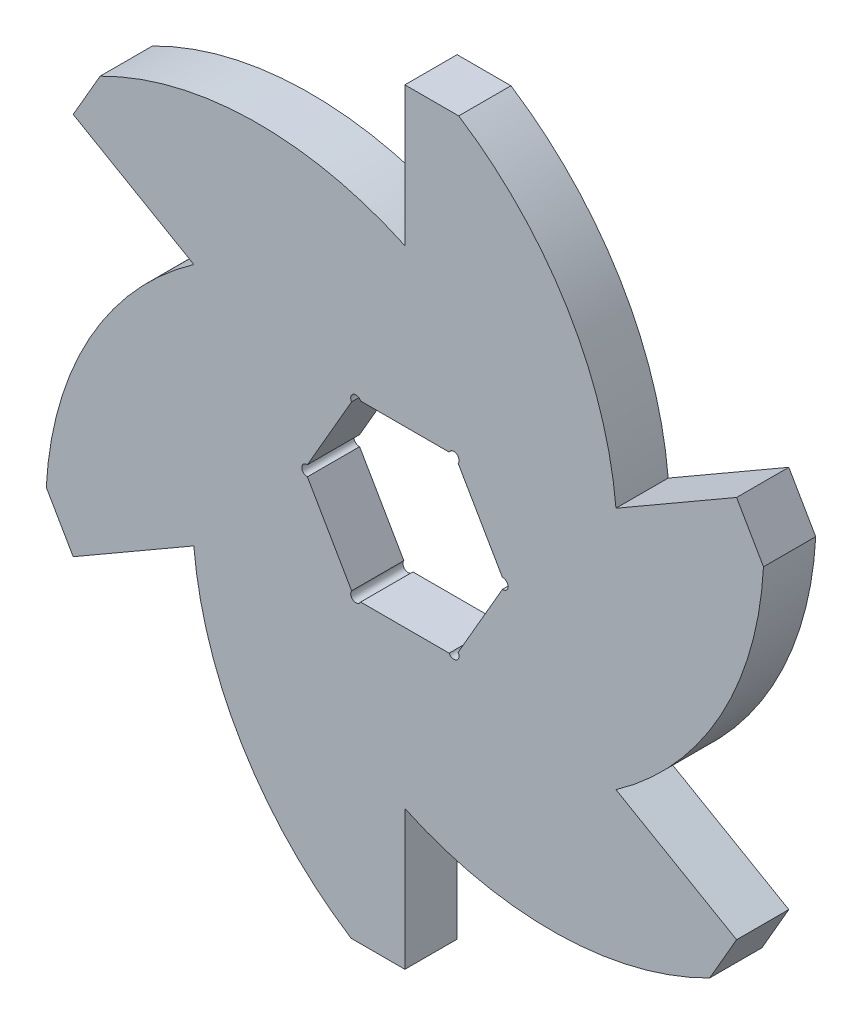
ISO-10303-21;
HEADER;
FILE_DESCRIPTION(('STEP AP214'),'2;1');
FILE_NAME('part.step','',(''),(''),'','','');
FILE_SCHEMA(('AUTOMOTIVE_DESIGN { 1 0 10303 214 1 1 1 1 }'));
ENDSEC;
DATA;
#1=APPLICATION_CONTEXT('core data for automotive mechanical design processes');
#2=APPLICATION_PROTOCOL_DEFINITION('international standard','automotive_design',2000,#1);
#3=PRODUCT_CONTEXT('',#1,'mechanical');
#4=PRODUCT('Part','Part','',(#3));
#5=PRODUCT_RELATED_PRODUCT_CATEGORY('part','',(#4));
#6=PRODUCT_DEFINITION_FORMATION('','',#4);
#7=PRODUCT_DEFINITION_CONTEXT('part definition',#1,'design');
#8=PRODUCT_DEFINITION('design','',#6,#7);
#9=PRODUCT_DEFINITION_SHAPE('','',#8);
#10=(LENGTH_UNIT() NAMED_UNIT(*) SI_UNIT(.MILLI.,.METRE.));
#11=(NAMED_UNIT(*) PLANE_ANGLE_UNIT() SI_UNIT($,.RADIAN.));
#12=(NAMED_UNIT(*) SI_UNIT($,.STERADIAN.) SOLID_ANGLE_UNIT());
#13=UNCERTAINTY_MEASURE_WITH_UNIT(LENGTH_MEASURE(1.E-05),#10,'distance_accuracy_value','');
#14=(GEOMETRIC_REPRESENTATION_CONTEXT(3) GLOBAL_UNCERTAINTY_ASSIGNED_CONTEXT((#13)) GLOBAL_UNIT_ASSIGNED_CONTEXT((#10,
#11,#12)) REPRESENTATION_CONTEXT('',''));
#15=CARTESIAN_POINT('',(0.,0.,0.));
#16=DIRECTION('',(0.,0.,1.));
#17=DIRECTION('',(1.,0.,0.));
#18=AXIS2_PLACEMENT_3D('',#15,#16,#17);
#19=CARTESIAN_POINT('',(-42.111348754247,-20.7007955097314,15.));
#20=DIRECTION('',(0.,0.,-1.));
#21=DIRECTION('',(-1.,0.,0.));
#22=AXIS2_PLACEMENT_3D('',#19,#20,#21);
#23=PLANE('',#22);
#24=CARTESIAN_POINT('',(-42.111348754247,-20.7007955097314,15.));
#25=DIRECTION('',(0.,0.,1.));
#26=DIRECTION('',(-1.,0.,0.));
#27=AXIS2_PLACEMENT_3D('',#24,#25,#26);
#28=CIRCLE('',#27,99.9999999999998);
#29=CARTESIAN_POINT('',(0.,70.,15.));
#30=VERTEX_POINT('',#29);
#31=CARTESIAN_POINT('',(-87.5330485076559,68.3883126433485,15.));
#32=VERTEX_POINT('',#31);
#33=EDGE_CURVE('E333',#30,#32,#28,.T.);
#34=ORIENTED_EDGE('',*,*,#33,.T.);
#35=DIRECTION('',(-0.500000000000011,-0.866025403784432,0.));
#36=VECTOR('',#35,1.);
#37=CARTESIAN_POINT('',(-95.2627944162876,55.0000000000011,15.));
#38=LINE('',#37,#36);
#39=CARTESIAN_POINT('',(-95.2627944162876,55.0000000000011,15.));
#40=VERTEX_POINT('',#39);
#41=EDGE_CURVE('E336',#32,#40,#38,.T.);
#42=ORIENTED_EDGE('',*,*,#41,.T.);
#43=DIRECTION('',(0.866025403784433,-0.50000000000001,0.));
#44=VECTOR('',#43,1.);
#45=CARTESIAN_POINT('',(-60.6217782649103,35.0000000000007,15.));
#46=LINE('',#45,#44);
#47=CARTESIAN_POINT('',(-60.6217782649103,35.0000000000007,15.));
#48=VERTEX_POINT('',#47);
#49=EDGE_CURVE('E339',#40,#48,#46,.T.);
#50=ORIENTED_EDGE('',*,*,#49,.T.);
#51=CARTESIAN_POINT('',(-3.12825958714913,-46.8198955636698,15.));
#52=DIRECTION('',(0.,0.,1.));
#53=DIRECTION('',(-1.,0.,0.));
#54=AXIS2_PLACEMENT_3D('',#51,#52,#53);
#55=CIRCLE('',#54,100.);
#56=CARTESIAN_POINT('',(-102.99254032492,-41.6116873566515,15.));
#57=VERTEX_POINT('',#56);
#58=EDGE_CURVE('E341',#48,#57,#55,.T.);
#59=ORIENTED_EDGE('',*,*,#58,.T.);
#60=DIRECTION('',(0.499999999999992,-0.866025403784443,0.));
#61=VECTOR('',#60,1.);
#62=CARTESIAN_POINT('',(-95.2627944162888,-54.9999999999991,15.));
#63=LINE('',#62,#61);
#64=CARTESIAN_POINT('',(-95.2627944162888,-54.9999999999991,15.));
#65=VERTEX_POINT('',#64);
#66=EDGE_CURVE('E343',#57,#65,#63,.T.);
#67=ORIENTED_EDGE('',*,*,#66,.T.);
#68=DIRECTION('',(0.866025403784443,0.499999999999992,0.));
#69=VECTOR('',#68,1.);
#70=CARTESIAN_POINT('',(-60.621778264911,-34.9999999999994,15.));
#71=LINE('',#70,#69);
#72=CARTESIAN_POINT('',(-60.621778264911,-34.9999999999995,15.));
#73=VERTEX_POINT('',#72);
#74=EDGE_CURVE('E345',#65,#73,#71,.T.);
#75=ORIENTED_EDGE('',*,*,#74,.T.);
#76=CARTESIAN_POINT('',(38.9830891670979,-26.1191000539382,15.));
#77=DIRECTION('',(0.,0.,1.));
#78=DIRECTION('',(-1.,0.,0.));
#79=AXIS2_PLACEMENT_3D('',#76,#77,#78);
#80=CIRCLE('',#79,100.);
#81=CARTESIAN_POINT('',(-15.4594918172639,-110.,15.));
#82=VERTEX_POINT('',#81);
#83=EDGE_CURVE('E347',#73,#82,#80,.T.);
#84=ORIENTED_EDGE('',*,*,#83,.T.);
#85=DIRECTION('',(1.,0.,0.));
#86=VECTOR('',#85,1.);
#87=CARTESIAN_POINT('',(-7.68125894545489E-13,-110.,15.));
#88=LINE('',#87,#86);
#89=CARTESIAN_POINT('',(-7.68125894545489E-13,-110.,15.));
#90=VERTEX_POINT('',#89);
#91=EDGE_CURVE('E349',#82,#90,#88,.T.);
#92=ORIENTED_EDGE('',*,*,#91,.T.);
#93=DIRECTION('',(0.,1.,0.));
#94=VECTOR('',#93,1.);
#95=CARTESIAN_POINT('',(-4.92661467177413E-13,-70.,15.));
#96=LINE('',#95,#94);
#97=CARTESIAN_POINT('',(-4.57966997657877E-13,-70.,15.));
#98=VERTEX_POINT('',#97);
#99=EDGE_CURVE('E351',#90,#98,#96,.T.);
#100=ORIENTED_EDGE('',*,*,#99,.T.);
#101=CARTESIAN_POINT('',(42.1113487542468,20.7007955097317,15.));
#102=DIRECTION('',(0.,0.,1.));
#103=DIRECTION('',(-1.,0.,0.));
#104=AXIS2_PLACEMENT_3D('',#101,#102,#103);
#105=CIRCLE('',#104,100.);
#106=CARTESIAN_POINT('',(87.5330485076564,-68.3883126433479,15.));
#107=VERTEX_POINT('',#106);
#108=EDGE_CURVE('E353',#98,#107,#105,.T.);
#109=ORIENTED_EDGE('',*,*,#108,.T.);
#110=DIRECTION('',(0.500000000000003,0.866025403784437,0.));
#111=VECTOR('',#110,1.);
#112=CARTESIAN_POINT('',(95.262794416288,-55.0000000000005,15.));
#113=LINE('',#112,#111);
#114=CARTESIAN_POINT('',(95.262794416288,-55.0000000000005,15.));
#115=VERTEX_POINT('',#114);
#116=EDGE_CURVE('E355',#107,#115,#113,.T.);
#117=ORIENTED_EDGE('',*,*,#116,.T.);
#118=DIRECTION('',(-0.866025403784436,0.500000000000004,0.));
#119=VECTOR('',#118,1.);
#120=CARTESIAN_POINT('',(60.6217782649106,-35.0000000000003,15.));
#121=LINE('',#120,#119);
#122=CARTESIAN_POINT('',(60.6217782649106,-35.0000000000002,15.));
#123=VERTEX_POINT('',#122);
#124=EDGE_CURVE('E357',#115,#123,#121,.T.);
#125=ORIENTED_EDGE('',*,*,#124,.T.);
#126=CARTESIAN_POINT('',(3.12825958714881,46.8198955636698,15.));
#127=DIRECTION('',(0.,0.,1.));
#128=DIRECTION('',(-1.,0.,0.));
#129=AXIS2_PLACEMENT_3D('',#126,#127,#128);
#130=CIRCLE('',#129,100.);
#131=CARTESIAN_POINT('',(102.99254032492,41.6116873566523,15.));
#132=VERTEX_POINT('',#131);
#133=EDGE_CURVE('E359',#123,#132,#130,.T.);
#134=ORIENTED_EDGE('',*,*,#133,.T.);
#135=DIRECTION('',(-0.499999999999998,0.86602540378444,0.));
#136=VECTOR('',#135,1.);
#137=CARTESIAN_POINT('',(95.2627944162884,54.9999999999998,15.));
#138=LINE('',#137,#136);
#139=CARTESIAN_POINT('',(95.2627944162884,54.9999999999998,15.));
#140=VERTEX_POINT('',#139);
#141=EDGE_CURVE('E361',#132,#140,#138,.T.);
#142=ORIENTED_EDGE('',*,*,#141,.T.);
#143=DIRECTION('',(-0.86602540378444,-0.499999999999998,0.));
#144=VECTOR('',#143,1.);
#145=CARTESIAN_POINT('',(60.6217782649108,34.9999999999999,15.));
#146=LINE('',#145,#144);
#147=CARTESIAN_POINT('',(60.6217782649108,34.9999999999999,15.));
#148=VERTEX_POINT('',#147);
#149=EDGE_CURVE('E363',#140,#148,#146,.T.);
#150=ORIENTED_EDGE('',*,*,#149,.T.);
#151=CARTESIAN_POINT('',(-38.983089167098,26.1191000539379,15.));
#152=DIRECTION('',(0.,0.,1.));
#153=DIRECTION('',(-1.,0.,0.));
#154=AXIS2_PLACEMENT_3D('',#151,#152,#153);
#155=CIRCLE('',#154,100.);
#156=CARTESIAN_POINT('',(15.4594918172631,110.,15.));
#157=VERTEX_POINT('',#156);
#158=EDGE_CURVE('E365',#148,#157,#155,.T.);
#159=ORIENTED_EDGE('',*,*,#158,.T.);
#160=DIRECTION('',(-1.,0.,0.));
#161=VECTOR('',#160,1.);
#162=CARTESIAN_POINT('',(0.,110.,15.));
#163=LINE('',#162,#161);
#164=CARTESIAN_POINT('',(0.,110.,15.));
#165=VERTEX_POINT('',#164);
#166=EDGE_CURVE('E367',#157,#165,#163,.T.);
#167=ORIENTED_EDGE('',*,*,#166,.T.);
#168=DIRECTION('',(0.,-1.,0.));
#169=VECTOR('',#168,1.);
#170=CARTESIAN_POINT('',(0.,70.,15.));
#171=LINE('',#170,#169);
#172=EDGE_CURVE('E369',#165,#30,#171,.T.);
#173=ORIENTED_EDGE('',*,*,#172,.T.);
#174=EDGE_LOOP('',(#34,#42,#50,#59,#67,#75,#84,#92,#100,#109,#117,#125,#134,#142,#150,#159,#167,#173));
#175=FACE_BOUND('',#174,.T.);
#176=CARTESIAN_POINT('',(-14.0587567297407,24.3504809471616,15.));
#177=DIRECTION('',(0.,0.,1.));
#178=DIRECTION('',(1.,0.,0.));
#179=AXIS2_PLACEMENT_3D('',#176,#177,#178);
#180=CIRCLE('',#179,1.5);
#181=CARTESIAN_POINT('',(-12.7066750014417,24.9999999999999,15.));
#182=VERTEX_POINT('',#181);
#183=CARTESIAN_POINT('',(-15.2972975938902,23.5043033488811,15.));
#184=VERTEX_POINT('',#183);
#185=EDGE_CURVE('E240',#182,#184,#180,.T.);
#186=ORIENTED_EDGE('',*,*,#185,.F.);
#187=DIRECTION('',(-1.,0.,0.));
#188=VECTOR('',#187,1.);
#189=CARTESIAN_POINT('',(12.7066750014417,25.,15.));
#190=LINE('',#189,#188);
#191=CARTESIAN_POINT('',(12.7066750014417,25.,15.));
#192=VERTEX_POINT('',#191);
#193=EDGE_CURVE('E281',#192,#182,#190,.T.);
#194=ORIENTED_EDGE('',*,*,#193,.F.);
#195=CARTESIAN_POINT('',(14.0587567297407,24.3504809471617,15.));
#196=DIRECTION('',(0.,0.,1.));
#197=DIRECTION('',(1.,0.,0.));
#198=AXIS2_PLACEMENT_3D('',#195,#196,#197);
#199=CIRCLE('',#198,1.5);
#200=CARTESIAN_POINT('',(15.2972975938901,23.5043033488811,15.));
#201=VERTEX_POINT('',#200);
#202=EDGE_CURVE('E279',#201,#192,#199,.T.);
#203=ORIENTED_EDGE('',*,*,#202,.F.);
#204=DIRECTION('',(-0.500000000000003,0.866025403784437,0.));
#205=VECTOR('',#204,1.);
#206=CARTESIAN_POINT('',(28.0039725953318,1.49569665111884,15.));
#207=LINE('',#206,#205);
#208=CARTESIAN_POINT('',(28.0039725953318,1.49569665111884,15.));
#209=VERTEX_POINT('',#208);
#210=EDGE_CURVE('E277',#209,#201,#207,.T.);
#211=ORIENTED_EDGE('',*,*,#210,.F.);
#212=CARTESIAN_POINT('',(28.1175134594814,0.,15.));
#213=DIRECTION('',(0.,0.,1.));
#214=DIRECTION('',(1.,0.,0.));
#215=AXIS2_PLACEMENT_3D('',#212,#213,#214);
#216=CIRCLE('',#215,1.5);
#217=CARTESIAN_POINT('',(28.0039725953317,-1.49569665111887,15.));
#218=VERTEX_POINT('',#217);
#219=EDGE_CURVE('E275',#218,#209,#216,.T.);
#220=ORIENTED_EDGE('',*,*,#219,.F.);
#221=DIRECTION('',(0.499999999999997,0.86602540378444,0.));
#222=VECTOR('',#221,1.);
#223=CARTESIAN_POINT('',(15.2972975938902,-23.5043033488811,15.));
#224=LINE('',#223,#222);
#225=CARTESIAN_POINT('',(15.2972975938902,-23.5043033488811,15.));
#226=VERTEX_POINT('',#225);
#227=EDGE_CURVE('E273',#226,#218,#224,.T.);
#228=ORIENTED_EDGE('',*,*,#227,.F.);
#229=CARTESIAN_POINT('',(14.0587567297408,-24.3504809471618,15.));
#230=DIRECTION('',(0.,0.,1.));
#231=DIRECTION('',(1.,0.,0.));
#232=AXIS2_PLACEMENT_3D('',#229,#230,#231);
#233=CIRCLE('',#232,1.5);
#234=CARTESIAN_POINT('',(12.7066750014417,-24.9999999999999,15.));
#235=VERTEX_POINT('',#234);
#236=EDGE_CURVE('E271',#235,#226,#233,.T.);
#237=ORIENTED_EDGE('',*,*,#236,.F.);
#238=DIRECTION('',(1.,0.,0.));
#239=VECTOR('',#238,1.);
#240=CARTESIAN_POINT('',(-12.7066750014415,-25.,15.));
#241=LINE('',#240,#239);
#242=CARTESIAN_POINT('',(-12.7066750014415,-25.,15.));
#243=VERTEX_POINT('',#242);
#244=EDGE_CURVE('E269',#243,#235,#241,.T.);
#245=ORIENTED_EDGE('',*,*,#244,.F.);
#246=CARTESIAN_POINT('',(-14.0587567297406,-24.3504809471618,15.));
#247=DIRECTION('',(0.,0.,1.));
#248=DIRECTION('',(1.,0.,0.));
#249=AXIS2_PLACEMENT_3D('',#246,#247,#248);
#250=CIRCLE('',#249,1.5);
#251=CARTESIAN_POINT('',(-15.29729759389,-23.5043033488812,15.));
#252=VERTEX_POINT('',#251);
#253=EDGE_CURVE('E267',#252,#243,#250,.T.);
#254=ORIENTED_EDGE('',*,*,#253,.F.);
#255=DIRECTION('',(0.500000000000003,-0.866025403784437,0.));
#256=VECTOR('',#255,1.);
#257=CARTESIAN_POINT('',(-28.0039725953318,-1.49569665111896,15.));
#258=LINE('',#257,#256);
#259=CARTESIAN_POINT('',(-28.0039725953318,-1.49569665111896,15.));
#260=VERTEX_POINT('',#259);
#261=EDGE_CURVE('E263',#260,#252,#258,.T.);
#262=ORIENTED_EDGE('',*,*,#261,.F.);
#263=CARTESIAN_POINT('',(-28.1175134594813,-1.01997420993214E-13,15.));
#264=DIRECTION('',(0.,0.,1.));
#265=DIRECTION('',(1.,0.,0.));
#266=AXIS2_PLACEMENT_3D('',#263,#264,#265);
#267=CIRCLE('',#266,1.5);
#268=CARTESIAN_POINT('',(-28.0039725953318,1.49569665111876,15.));
#269=VERTEX_POINT('',#268);
#270=EDGE_CURVE('E261',#269,#260,#267,.T.);
#271=ORIENTED_EDGE('',*,*,#270,.F.);
#272=DIRECTION('',(-0.499999999999997,-0.86602540378444,0.));
#273=VECTOR('',#272,1.);
#274=CARTESIAN_POINT('',(-15.2972975938902,23.5043033488811,15.));
#275=LINE('',#274,#273);
#276=EDGE_CURVE('E248',#184,#269,#275,.T.);
#277=ORIENTED_EDGE('',*,*,#276,.F.);
#278=EDGE_LOOP('',(#186,#194,#203,#211,#220,#228,#237,#245,#254,#262,#271,#277));
#279=FACE_BOUND('',#278,.T.);
#280=ADVANCED_FACE('F43',(#175,#279),#23,.F.);
#281=CARTESIAN_POINT('',(-42.111348754247,-20.7007955097314,0.));
#282=DIRECTION('',(0.,0.,-1.));
#283=DIRECTION('',(-1.,0.,0.));
#284=AXIS2_PLACEMENT_3D('',#281,#282,#283);
#285=PLANE('',#284);
#286=CARTESIAN_POINT('',(-42.111348754247,-20.7007955097314,0.));
#287=DIRECTION('',(0.,0.,1.));
#288=DIRECTION('',(-1.,0.,0.));
#289=AXIS2_PLACEMENT_3D('',#286,#287,#288);
#290=CIRCLE('',#289,99.9999999999998);
#291=CARTESIAN_POINT('',(0.,70.,0.));
#292=VERTEX_POINT('',#291);
#293=CARTESIAN_POINT('',(-87.5330485076559,68.3883126433485,0.));
#294=VERTEX_POINT('',#293);
#295=EDGE_CURVE('E256',#292,#294,#290,.T.);
#296=ORIENTED_EDGE('',*,*,#295,.F.);
#297=DIRECTION('',(0.,-1.,0.));
#298=VECTOR('',#297,1.);
#299=CARTESIAN_POINT('',(0.,70.,0.));
#300=LINE('',#299,#298);
#301=CARTESIAN_POINT('',(0.,110.,0.));
#302=VERTEX_POINT('',#301);
#303=EDGE_CURVE('E337',#302,#292,#300,.T.);
#304=ORIENTED_EDGE('',*,*,#303,.F.);
#305=DIRECTION('',(-1.,0.,0.));
#306=VECTOR('',#305,1.);
#307=CARTESIAN_POINT('',(0.,110.,0.));
#308=LINE('',#307,#306);
#309=CARTESIAN_POINT('',(15.4594918172631,110.,0.));
#310=VERTEX_POINT('',#309);
#311=EDGE_CURVE('E404',#310,#302,#308,.T.);
#312=ORIENTED_EDGE('',*,*,#311,.F.);
#313=CARTESIAN_POINT('',(-38.983089167098,26.1191000539379,0.));
#314=DIRECTION('',(0.,0.,1.));
#315=DIRECTION('',(-1.,0.,0.));
#316=AXIS2_PLACEMENT_3D('',#313,#314,#315);
#317=CIRCLE('',#316,100.);
#318=CARTESIAN_POINT('',(60.6217782649108,34.9999999999999,0.));
#319=VERTEX_POINT('',#318);
#320=EDGE_CURVE('E402',#319,#310,#317,.T.);
#321=ORIENTED_EDGE('',*,*,#320,.F.);
#322=DIRECTION('',(-0.86602540378444,-0.499999999999998,0.));
#323=VECTOR('',#322,1.);
#324=CARTESIAN_POINT('',(60.6217782649108,34.9999999999999,0.));
#325=LINE('',#324,#323);
#326=CARTESIAN_POINT('',(95.2627944162884,54.9999999999998,0.));
#327=VERTEX_POINT('',#326);
#328=EDGE_CURVE('E400',#327,#319,#325,.T.);
#329=ORIENTED_EDGE('',*,*,#328,.F.);
#330=DIRECTION('',(-0.499999999999998,0.86602540378444,0.));
#331=VECTOR('',#330,1.);
#332=CARTESIAN_POINT('',(95.2627944162884,54.9999999999998,0.));
#333=LINE('',#332,#331);
#334=CARTESIAN_POINT('',(102.99254032492,41.6116873566523,0.));
#335=VERTEX_POINT('',#334);
#336=EDGE_CURVE('E398',#335,#327,#333,.T.);
#337=ORIENTED_EDGE('',*,*,#336,.F.);
#338=CARTESIAN_POINT('',(3.12825958714881,46.8198955636698,0.));
#339=DIRECTION('',(0.,0.,1.));
#340=DIRECTION('',(-1.,0.,0.));
#341=AXIS2_PLACEMENT_3D('',#338,#339,#340);
#342=CIRCLE('',#341,100.);
#343=CARTESIAN_POINT('',(60.6217782649106,-35.0000000000002,0.));
#344=VERTEX_POINT('',#343);
#345=EDGE_CURVE('E396',#344,#335,#342,.T.);
#346=ORIENTED_EDGE('',*,*,#345,.F.);
#347=DIRECTION('',(-0.866025403784436,0.500000000000004,0.));
#348=VECTOR('',#347,1.);
#349=CARTESIAN_POINT('',(60.6217782649106,-35.0000000000003,0.));
#350=LINE('',#349,#348);
#351=CARTESIAN_POINT('',(95.262794416288,-55.0000000000005,0.));
#352=VERTEX_POINT('',#351);
#353=EDGE_CURVE('E394',#352,#344,#350,.T.);
#354=ORIENTED_EDGE('',*,*,#353,.F.);
#355=DIRECTION('',(0.500000000000003,0.866025403784437,0.));
#356=VECTOR('',#355,1.);
#357=CARTESIAN_POINT('',(95.262794416288,-55.0000000000005,0.));
#358=LINE('',#357,#356);
#359=CARTESIAN_POINT('',(87.5330485076564,-68.3883126433479,0.));
#360=VERTEX_POINT('',#359);
#361=EDGE_CURVE('E392',#360,#352,#358,.T.);
#362=ORIENTED_EDGE('',*,*,#361,.F.);
#363=CARTESIAN_POINT('',(42.1113487542468,20.7007955097317,0.));
#364=DIRECTION('',(0.,0.,1.));
#365=DIRECTION('',(-1.,0.,0.));
#366=AXIS2_PLACEMENT_3D('',#363,#364,#365);
#367=CIRCLE('',#366,100.);
#368=CARTESIAN_POINT('',(-4.57966997657877E-13,-70.,0.));
#369=VERTEX_POINT('',#368);
#370=EDGE_CURVE('E390',#369,#360,#367,.T.);
#371=ORIENTED_EDGE('',*,*,#370,.F.);
#372=DIRECTION('',(0.,1.,0.));
#373=VECTOR('',#372,1.);
#374=CARTESIAN_POINT('',(-4.92661467177413E-13,-70.,0.));
#375=LINE('',#374,#373);
#376=CARTESIAN_POINT('',(-7.68125894545489E-13,-110.,0.));
#377=VERTEX_POINT('',#376);
#378=EDGE_CURVE('E388',#377,#369,#375,.T.);
#379=ORIENTED_EDGE('',*,*,#378,.F.);
#380=DIRECTION('',(1.,0.,0.));
#381=VECTOR('',#380,1.);
#382=CARTESIAN_POINT('',(-7.68125894545489E-13,-110.,0.));
#383=LINE('',#382,#381);
#384=CARTESIAN_POINT('',(-15.4594918172639,-110.,0.));
#385=VERTEX_POINT('',#384);
#386=EDGE_CURVE('E386',#385,#377,#383,.T.);
#387=ORIENTED_EDGE('',*,*,#386,.F.);
#388=CARTESIAN_POINT('',(38.9830891670979,-26.1191000539382,0.));
#389=DIRECTION('',(0.,0.,1.));
#390=DIRECTION('',(-1.,0.,0.));
#391=AXIS2_PLACEMENT_3D('',#388,#389,#390);
#392=CIRCLE('',#391,100.);
#393=CARTESIAN_POINT('',(-60.621778264911,-34.9999999999995,0.));
#394=VERTEX_POINT('',#393);
#395=EDGE_CURVE('E384',#394,#385,#392,.T.);
#396=ORIENTED_EDGE('',*,*,#395,.F.);
#397=DIRECTION('',(0.866025403784443,0.499999999999992,0.));
#398=VECTOR('',#397,1.);
#399=CARTESIAN_POINT('',(-60.621778264911,-34.9999999999994,0.));
#400=LINE('',#399,#398);
#401=CARTESIAN_POINT('',(-95.2627944162888,-54.9999999999991,0.));
#402=VERTEX_POINT('',#401);
#403=EDGE_CURVE('E382',#402,#394,#400,.T.);
#404=ORIENTED_EDGE('',*,*,#403,.F.);
#405=DIRECTION('',(0.499999999999992,-0.866025403784443,0.));
#406=VECTOR('',#405,1.);
#407=CARTESIAN_POINT('',(-95.2627944162888,-54.9999999999991,0.));
#408=LINE('',#407,#406);
#409=CARTESIAN_POINT('',(-102.99254032492,-41.6116873566515,0.));
#410=VERTEX_POINT('',#409);
#411=EDGE_CURVE('E380',#410,#402,#408,.T.);
#412=ORIENTED_EDGE('',*,*,#411,.F.);
#413=CARTESIAN_POINT('',(-3.12825958714913,-46.8198955636698,0.));
#414=DIRECTION('',(0.,0.,1.));
#415=DIRECTION('',(-1.,0.,0.));
#416=AXIS2_PLACEMENT_3D('',#413,#414,#415);
#417=CIRCLE('',#416,100.);
#418=CARTESIAN_POINT('',(-60.6217782649103,35.0000000000007,0.));
#419=VERTEX_POINT('',#418);
#420=EDGE_CURVE('E378',#419,#410,#417,.T.);
#421=ORIENTED_EDGE('',*,*,#420,.F.);
#422=DIRECTION('',(0.866025403784433,-0.50000000000001,0.));
#423=VECTOR('',#422,1.);
#424=CARTESIAN_POINT('',(-60.6217782649103,35.0000000000007,0.));
#425=LINE('',#424,#423);
#426=CARTESIAN_POINT('',(-95.2627944162876,55.0000000000011,0.));
#427=VERTEX_POINT('',#426);
#428=EDGE_CURVE('E376',#427,#419,#425,.T.);
#429=ORIENTED_EDGE('',*,*,#428,.F.);
#430=DIRECTION('',(-0.500000000000011,-0.866025403784432,0.));
#431=VECTOR('',#430,1.);
#432=CARTESIAN_POINT('',(-95.2627944162876,55.0000000000011,0.));
#433=LINE('',#432,#431);
#434=EDGE_CURVE('E374',#294,#427,#433,.T.);
#435=ORIENTED_EDGE('',*,*,#434,.F.);
#436=EDGE_LOOP('',(#296,#304,#312,#321,#329,#337,#346,#354,#362,#371,#379,#387,#396,#404,#412,
#421,#429,#435));
#437=FACE_BOUND('',#436,.T.);
#438=DIRECTION('',(-1.,0.,0.));
#439=VECTOR('',#438,1.);
#440=CARTESIAN_POINT('',(12.7066750014417,25.,0.));
#441=LINE('',#440,#439);
#442=CARTESIAN_POINT('',(12.7066750014417,25.,0.));
#443=VERTEX_POINT('',#442);
#444=CARTESIAN_POINT('',(-12.7066750014417,24.9999999999999,0.));
#445=VERTEX_POINT('',#444);
#446=EDGE_CURVE('E249',#443,#445,#441,.T.);
#447=ORIENTED_EDGE('',*,*,#446,.T.);
#448=CARTESIAN_POINT('',(-14.0587567297407,24.3504809471616,0.));
#449=DIRECTION('',(0.,0.,1.));
#450=DIRECTION('',(1.,0.,0.));
#451=AXIS2_PLACEMENT_3D('',#448,#449,#450);
#452=CIRCLE('',#451,1.5);
#453=CARTESIAN_POINT('',(-15.2972975938902,23.5043033488811,0.));
#454=VERTEX_POINT('',#453);
#455=EDGE_CURVE('E66',#445,#454,#452,.T.);
#456=ORIENTED_EDGE('',*,*,#455,.T.);
#457=DIRECTION('',(-0.499999999999997,-0.86602540378444,0.));
#458=VECTOR('',#457,1.);
#459=CARTESIAN_POINT('',(-15.2972975938902,23.5043033488811,0.));
#460=LINE('',#459,#458);
#461=CARTESIAN_POINT('',(-28.0039725953318,1.49569665111876,0.));
#462=VERTEX_POINT('',#461);
#463=EDGE_CURVE('E255',#454,#462,#460,.T.);
#464=ORIENTED_EDGE('',*,*,#463,.T.);
#465=CARTESIAN_POINT('',(-28.1175134594813,-1.01997420993214E-13,0.));
#466=DIRECTION('',(0.,0.,1.));
#467=DIRECTION('',(1.,0.,0.));
#468=AXIS2_PLACEMENT_3D('',#465,#466,#467);
#469=CIRCLE('',#468,1.5);
#470=CARTESIAN_POINT('',(-28.0039725953318,-1.49569665111896,0.));
#471=VERTEX_POINT('',#470);
#472=EDGE_CURVE('E285',#462,#471,#469,.T.);
#473=ORIENTED_EDGE('',*,*,#472,.T.);
#474=DIRECTION('',(0.500000000000003,-0.866025403784437,0.));
#475=VECTOR('',#474,1.);
#476=CARTESIAN_POINT('',(-28.0039725953318,-1.49569665111896,0.));
#477=LINE('',#476,#475);
#478=CARTESIAN_POINT('',(-15.29729759389,-23.5043033488812,0.));
#479=VERTEX_POINT('',#478);
#480=EDGE_CURVE('E288',#471,#479,#477,.T.);
#481=ORIENTED_EDGE('',*,*,#480,.T.);
#482=CARTESIAN_POINT('',(-14.0587567297406,-24.3504809471618,0.));
#483=DIRECTION('',(0.,0.,1.));
#484=DIRECTION('',(1.,0.,0.));
#485=AXIS2_PLACEMENT_3D('',#482,#483,#484);
#486=CIRCLE('',#485,1.5);
#487=CARTESIAN_POINT('',(-12.7066750014415,-25.,0.));
#488=VERTEX_POINT('',#487);
#489=EDGE_CURVE('E291',#479,#488,#486,.T.);
#490=ORIENTED_EDGE('',*,*,#489,.T.);
#491=DIRECTION('',(1.,0.,0.));
#492=VECTOR('',#491,1.);
#493=CARTESIAN_POINT('',(-12.7066750014415,-25.,0.));
#494=LINE('',#493,#492);
#495=CARTESIAN_POINT('',(12.7066750014417,-24.9999999999999,0.));
#496=VERTEX_POINT('',#495);
#497=EDGE_CURVE('E294',#488,#496,#494,.T.);
#498=ORIENTED_EDGE('',*,*,#497,.T.);
#499=CARTESIAN_POINT('',(14.0587567297408,-24.3504809471618,0.));
#500=DIRECTION('',(0.,0.,1.));
#501=DIRECTION('',(1.,0.,0.));
#502=AXIS2_PLACEMENT_3D('',#499,#500,#501);
#503=CIRCLE('',#502,1.5);
#504=CARTESIAN_POINT('',(15.2972975938902,-23.5043033488811,0.));
#505=VERTEX_POINT('',#504);
#506=EDGE_CURVE('E297',#496,#505,#503,.T.);
#507=ORIENTED_EDGE('',*,*,#506,.T.);
#508=DIRECTION('',(0.499999999999997,0.86602540378444,0.));
#509=VECTOR('',#508,1.);
#510=CARTESIAN_POINT('',(15.2972975938902,-23.5043033488811,0.));
#511=LINE('',#510,#509);
#512=CARTESIAN_POINT('',(28.0039725953317,-1.49569665111887,0.));
#513=VERTEX_POINT('',#512);
#514=EDGE_CURVE('E300',#505,#513,#511,.T.);
#515=ORIENTED_EDGE('',*,*,#514,.T.);
#516=CARTESIAN_POINT('',(28.1175134594814,0.,0.));
#517=DIRECTION('',(0.,0.,1.));
#518=DIRECTION('',(1.,0.,0.));
#519=AXIS2_PLACEMENT_3D('',#516,#517,#518);
#520=CIRCLE('',#519,1.5);
#521=CARTESIAN_POINT('',(28.0039725953318,1.49569665111884,0.));
#522=VERTEX_POINT('',#521);
#523=EDGE_CURVE('E303',#513,#522,#520,.T.);
#524=ORIENTED_EDGE('',*,*,#523,.T.);
#525=DIRECTION('',(-0.500000000000003,0.866025403784437,0.));
#526=VECTOR('',#525,1.);
#527=CARTESIAN_POINT('',(28.0039725953318,1.49569665111884,0.));
#528=LINE('',#527,#526);
#529=CARTESIAN_POINT('',(15.2972975938901,23.5043033488811,0.));
#530=VERTEX_POINT('',#529);
#531=EDGE_CURVE('E306',#522,#530,#528,.T.);
#532=ORIENTED_EDGE('',*,*,#531,.T.);
#533=CARTESIAN_POINT('',(14.0587567297407,24.3504809471617,0.));
#534=DIRECTION('',(0.,0.,1.));
#535=DIRECTION('',(1.,0.,0.));
#536=AXIS2_PLACEMENT_3D('',#533,#534,#535);
#537=CIRCLE('',#536,1.5);
#538=EDGE_CURVE('E309',#530,#443,#537,.T.);
#539=ORIENTED_EDGE('',*,*,#538,.T.);
#540=EDGE_LOOP('',(#447,#456,#464,#473,#481,#490,#498,#507,#515,#524,#532,#539));
#541=FACE_BOUND('',#540,.T.);
#542=ADVANCED_FACE('F464',(#437,#541),#285,.T.);
#543=CARTESIAN_POINT('',(-42.111348754247,-20.7007955097314,15.));
#544=DIRECTION('',(0.,0.,-1.));
#545=DIRECTION('',(-1.,0.,0.));
#546=AXIS2_PLACEMENT_3D('',#543,#544,#545);
#547=CYLINDRICAL_SURFACE('',#546,99.9999999999998);
#548=ORIENTED_EDGE('',*,*,#295,.T.);
#549=DIRECTION('',(0.,0.,-1.));
#550=VECTOR('',#549,1.);
#551=CARTESIAN_POINT('',(-87.5330485076559,68.3883126433485,15.));
#552=LINE('',#551,#550);
#553=EDGE_CURVE('E11',#32,#294,#552,.T.);
#554=ORIENTED_EDGE('',*,*,#553,.F.);
#555=ORIENTED_EDGE('',*,*,#33,.F.);
#556=DIRECTION('',(0.,0.,-1.));
#557=VECTOR('',#556,1.);
#558=CARTESIAN_POINT('',(0.,70.,15.));
#559=LINE('',#558,#557);
#560=EDGE_CURVE('E371',#30,#292,#559,.T.);
#561=ORIENTED_EDGE('',*,*,#560,.T.);
#562=EDGE_LOOP('',(#548,#554,#555,#561));
#563=FACE_BOUND('',#562,.T.);
#564=ADVANCED_FACE('F45',(#563),#547,.T.);
#565=CARTESIAN_POINT('',(-95.2627944162876,55.0000000000011,15.));
#566=DIRECTION('',(0.866025403784432,-0.500000000000011,0.));
#567=DIRECTION('',(0.500000000000011,0.866025403784433,0.));
#568=AXIS2_PLACEMENT_3D('',#565,#566,#567);
#569=PLANE('',#568);
#570=ORIENTED_EDGE('',*,*,#434,.T.);
#571=DIRECTION('',(0.,0.,-1.));
#572=VECTOR('',#571,1.);
#573=CARTESIAN_POINT('',(-95.2627944162876,55.0000000000011,15.));
#574=LINE('',#573,#572);
#575=EDGE_CURVE('E51',#40,#427,#574,.T.);
#576=ORIENTED_EDGE('',*,*,#575,.F.);
#577=ORIENTED_EDGE('',*,*,#41,.F.);
#578=ORIENTED_EDGE('',*,*,#553,.T.);
#579=EDGE_LOOP('',(#570,#576,#577,#578));
#580=FACE_BOUND('',#579,.T.);
#581=ADVANCED_FACE('F481',(#580),#569,.F.);
#582=CARTESIAN_POINT('',(-60.6217782649103,35.0000000000007,15.));
#583=DIRECTION('',(0.50000000000001,0.866025403784433,0.));
#584=DIRECTION('',(-0.866025403784433,0.50000000000001,0.));
#585=AXIS2_PLACEMENT_3D('',#582,#583,#584);
#586=PLANE('',#585);
#587=ORIENTED_EDGE('',*,*,#428,.T.);
#588=DIRECTION('',(0.,0.,-1.));
#589=VECTOR('',#588,1.);
#590=CARTESIAN_POINT('',(-60.6217782649103,35.0000000000007,15.));
#591=LINE('',#590,#589);
#592=EDGE_CURVE('E451',#48,#419,#591,.T.);
#593=ORIENTED_EDGE('',*,*,#592,.F.);
#594=ORIENTED_EDGE('',*,*,#49,.F.);
#595=ORIENTED_EDGE('',*,*,#575,.T.);
#596=EDGE_LOOP('',(#587,#593,#594,#595));
#597=FACE_BOUND('',#596,.T.);
#598=ADVANCED_FACE('F458',(#597),#586,.F.);
#599=CARTESIAN_POINT('',(-3.12825958714913,-46.8198955636698,15.));
#600=DIRECTION('',(0.,0.,-1.));
#601=DIRECTION('',(-1.,0.,0.));
#602=AXIS2_PLACEMENT_3D('',#599,#600,#601);
#603=CYLINDRICAL_SURFACE('',#602,100.);
#604=ORIENTED_EDGE('',*,*,#420,.T.);
#605=DIRECTION('',(0.,0.,-1.));
#606=VECTOR('',#605,1.);
#607=CARTESIAN_POINT('',(-102.99254032492,-41.6116873566515,15.));
#608=LINE('',#607,#606);
#609=EDGE_CURVE('E448',#57,#410,#608,.T.);
#610=ORIENTED_EDGE('',*,*,#609,.F.);
#611=ORIENTED_EDGE('',*,*,#58,.F.);
#612=ORIENTED_EDGE('',*,*,#592,.T.);
#613=EDGE_LOOP('',(#604,#610,#611,#612));
#614=FACE_BOUND('',#613,.T.);
#615=ADVANCED_FACE('F470',(#614),#603,.T.);
#616=CARTESIAN_POINT('',(-95.2627944162888,-54.9999999999991,15.));
#617=DIRECTION('',(0.866025403784443,0.499999999999992,0.));
#618=DIRECTION('',(-0.499999999999992,0.866025403784443,0.));
#619=AXIS2_PLACEMENT_3D('',#616,#617,#618);
#620=PLANE('',#619);
#621=ORIENTED_EDGE('',*,*,#411,.T.);
#622=DIRECTION('',(0.,0.,-1.));
#623=VECTOR('',#622,1.);
#624=CARTESIAN_POINT('',(-95.2627944162888,-54.9999999999991,15.));
#625=LINE('',#624,#623);
#626=EDGE_CURVE('E445',#65,#402,#625,.T.);
#627=ORIENTED_EDGE('',*,*,#626,.F.);
#628=ORIENTED_EDGE('',*,*,#66,.F.);
#629=ORIENTED_EDGE('',*,*,#609,.T.);
#630=EDGE_LOOP('',(#621,#627,#628,#629));
#631=FACE_BOUND('',#630,.T.);
#632=ADVANCED_FACE('F474',(#631),#620,.F.);
#633=CARTESIAN_POINT('',(-60.621778264911,-34.9999999999994,15.));
#634=DIRECTION('',(-0.499999999999992,0.866025403784443,0.));
#635=DIRECTION('',(-0.866025403784443,-0.499999999999992,0.));
#636=AXIS2_PLACEMENT_3D('',#633,#634,#635);
#637=PLANE('',#636);
#638=ORIENTED_EDGE('',*,*,#403,.T.);
#639=DIRECTION('',(0.,0.,-1.));
#640=VECTOR('',#639,1.);
#641=CARTESIAN_POINT('',(-60.621778264911,-34.9999999999995,15.));
#642=LINE('',#641,#640);
#643=EDGE_CURVE('E442',#73,#394,#642,.T.);
#644=ORIENTED_EDGE('',*,*,#643,.F.);
#645=ORIENTED_EDGE('',*,*,#74,.F.);
#646=ORIENTED_EDGE('',*,*,#626,.T.);
#647=EDGE_LOOP('',(#638,#644,#645,#646));
#648=FACE_BOUND('',#647,.T.);
#649=ADVANCED_FACE('F544',(#648),#637,.F.);
#650=CARTESIAN_POINT('',(38.9830891670979,-26.1191000539382,15.));
#651=DIRECTION('',(0.,0.,-1.));
#652=DIRECTION('',(-1.,0.,0.));
#653=AXIS2_PLACEMENT_3D('',#650,#651,#652);
#654=CYLINDRICAL_SURFACE('',#653,100.);
#655=ORIENTED_EDGE('',*,*,#395,.T.);
#656=DIRECTION('',(0.,0.,-1.));
#657=VECTOR('',#656,1.);
#658=CARTESIAN_POINT('',(-15.4594918172639,-110.,15.));
#659=LINE('',#658,#657);
#660=EDGE_CURVE('E439',#82,#385,#659,.T.);
#661=ORIENTED_EDGE('',*,*,#660,.F.);
#662=ORIENTED_EDGE('',*,*,#83,.F.);
#663=ORIENTED_EDGE('',*,*,#643,.T.);
#664=EDGE_LOOP('',(#655,#661,#662,#663));
#665=FACE_BOUND('',#664,.T.);
#666=ADVANCED_FACE('F542',(#665),#654,.T.);
#667=CARTESIAN_POINT('',(-7.68125894545489E-13,-110.,15.));
#668=DIRECTION('',(0.,1.,0.));
#669=DIRECTION('',(-1.,0.,0.));
#670=AXIS2_PLACEMENT_3D('',#667,#668,#669);
#671=PLANE('',#670);
#672=ORIENTED_EDGE('',*,*,#386,.T.);
#673=DIRECTION('',(0.,0.,-1.));
#674=VECTOR('',#673,1.);
#675=CARTESIAN_POINT('',(-7.68125894545489E-13,-110.,15.));
#676=LINE('',#675,#674);
#677=EDGE_CURVE('E436',#90,#377,#676,.T.);
#678=ORIENTED_EDGE('',*,*,#677,.F.);
#679=ORIENTED_EDGE('',*,*,#91,.F.);
#680=ORIENTED_EDGE('',*,*,#660,.T.);
#681=EDGE_LOOP('',(#672,#678,#679,#680));
#682=FACE_BOUND('',#681,.T.);
#683=ADVANCED_FACE('F538',(#682),#671,.F.);
#684=CARTESIAN_POINT('',(-4.92661467177413E-13,-70.,15.));
#685=DIRECTION('',(-1.,0.,0.));
#686=DIRECTION('',(0.,-1.,0.));
#687=AXIS2_PLACEMENT_3D('',#684,#685,#686);
#688=PLANE('',#687);
#689=ORIENTED_EDGE('',*,*,#378,.T.);
#690=DIRECTION('',(0.,0.,-1.));
#691=VECTOR('',#690,1.);
#692=CARTESIAN_POINT('',(-4.57966997657877E-13,-70.,15.));
#693=LINE('',#692,#691);
#694=EDGE_CURVE('E433',#98,#369,#693,.T.);
#695=ORIENTED_EDGE('',*,*,#694,.F.);
#696=ORIENTED_EDGE('',*,*,#99,.F.);
#697=ORIENTED_EDGE('',*,*,#677,.T.);
#698=EDGE_LOOP('',(#689,#695,#696,#697));
#699=FACE_BOUND('',#698,.T.);
#700=ADVANCED_FACE('F533',(#699),#688,.F.);
#701=CARTESIAN_POINT('',(42.1113487542468,20.7007955097317,15.));
#702=DIRECTION('',(0.,0.,-1.));
#703=DIRECTION('',(-1.,0.,0.));
#704=AXIS2_PLACEMENT_3D('',#701,#702,#703);
#705=CYLINDRICAL_SURFACE('',#704,100.);
#706=ORIENTED_EDGE('',*,*,#370,.T.);
#707=DIRECTION('',(0.,0.,-1.));
#708=VECTOR('',#707,1.);
#709=CARTESIAN_POINT('',(87.5330485076564,-68.3883126433479,15.));
#710=LINE('',#709,#708);
#711=EDGE_CURVE('E430',#107,#360,#710,.T.);
#712=ORIENTED_EDGE('',*,*,#711,.F.);
#713=ORIENTED_EDGE('',*,*,#108,.F.);
#714=ORIENTED_EDGE('',*,*,#694,.T.);
#715=EDGE_LOOP('',(#706,#712,#713,#714));
#716=FACE_BOUND('',#715,.T.);
#717=ADVANCED_FACE('F527',(#716),#705,.T.);
#718=CARTESIAN_POINT('',(95.262794416288,-55.0000000000005,15.));
#719=DIRECTION('',(-0.866025403784437,0.500000000000003,0.));
#720=DIRECTION('',(-0.500000000000003,-0.866025403784437,0.));
#721=AXIS2_PLACEMENT_3D('',#718,#719,#720);
#722=PLANE('',#721);
#723=ORIENTED_EDGE('',*,*,#361,.T.);
#724=DIRECTION('',(0.,0.,-1.));
#725=VECTOR('',#724,1.);
#726=CARTESIAN_POINT('',(95.262794416288,-55.0000000000005,15.));
#727=LINE('',#726,#725);
#728=EDGE_CURVE('E427',#115,#352,#727,.T.);
#729=ORIENTED_EDGE('',*,*,#728,.F.);
#730=ORIENTED_EDGE('',*,*,#116,.F.);
#731=ORIENTED_EDGE('',*,*,#711,.T.);
#732=EDGE_LOOP('',(#723,#729,#730,#731));
#733=FACE_BOUND('',#732,.T.);
#734=ADVANCED_FACE('F523',(#733),#722,.F.);
#735=CARTESIAN_POINT('',(60.6217782649106,-35.0000000000003,15.));
#736=DIRECTION('',(-0.500000000000004,-0.866025403784436,0.));
#737=DIRECTION('',(0.866025403784436,-0.500000000000004,0.));
#738=AXIS2_PLACEMENT_3D('',#735,#736,#737);
#739=PLANE('',#738);
#740=ORIENTED_EDGE('',*,*,#353,.T.);
#741=DIRECTION('',(0.,0.,-1.));
#742=VECTOR('',#741,1.);
#743=CARTESIAN_POINT('',(60.6217782649106,-35.0000000000002,15.));
#744=LINE('',#743,#742);
#745=EDGE_CURVE('E424',#123,#344,#744,.T.);
#746=ORIENTED_EDGE('',*,*,#745,.F.);
#747=ORIENTED_EDGE('',*,*,#124,.F.);
#748=ORIENTED_EDGE('',*,*,#728,.T.);
#749=EDGE_LOOP('',(#740,#746,#747,#748));
#750=FACE_BOUND('',#749,.T.);
#751=ADVANCED_FACE('F518',(#750),#739,.F.);
#752=CARTESIAN_POINT('',(3.12825958714881,46.8198955636698,15.));
#753=DIRECTION('',(0.,0.,-1.));
#754=DIRECTION('',(-1.,0.,0.));
#755=AXIS2_PLACEMENT_3D('',#752,#753,#754);
#756=CYLINDRICAL_SURFACE('',#755,100.);
#757=ORIENTED_EDGE('',*,*,#345,.T.);
#758=DIRECTION('',(0.,0.,-1.));
#759=VECTOR('',#758,1.);
#760=CARTESIAN_POINT('',(102.99254032492,41.6116873566523,15.));
#761=LINE('',#760,#759);
#762=EDGE_CURVE('E421',#132,#335,#761,.T.);
#763=ORIENTED_EDGE('',*,*,#762,.F.);
#764=ORIENTED_EDGE('',*,*,#133,.F.);
#765=ORIENTED_EDGE('',*,*,#745,.T.);
#766=EDGE_LOOP('',(#757,#763,#764,#765));
#767=FACE_BOUND('',#766,.T.);
#768=ADVANCED_FACE('F512',(#767),#756,.T.);
#769=CARTESIAN_POINT('',(95.2627944162884,54.9999999999998,15.));
#770=DIRECTION('',(-0.86602540378444,-0.499999999999998,0.));
#771=DIRECTION('',(0.499999999999998,-0.86602540378444,0.));
#772=AXIS2_PLACEMENT_3D('',#769,#770,#771);
#773=PLANE('',#772);
#774=ORIENTED_EDGE('',*,*,#336,.T.);
#775=DIRECTION('',(0.,0.,-1.));
#776=VECTOR('',#775,1.);
#777=CARTESIAN_POINT('',(95.2627944162884,54.9999999999998,15.));
#778=LINE('',#777,#776);
#779=EDGE_CURVE('E418',#140,#327,#778,.T.);
#780=ORIENTED_EDGE('',*,*,#779,.F.);
#781=ORIENTED_EDGE('',*,*,#141,.F.);
#782=ORIENTED_EDGE('',*,*,#762,.T.);
#783=EDGE_LOOP('',(#774,#780,#781,#782));
#784=FACE_BOUND('',#783,.T.);
#785=ADVANCED_FACE('F508',(#784),#773,.F.);
#786=CARTESIAN_POINT('',(60.6217782649108,34.9999999999999,15.));
#787=DIRECTION('',(0.499999999999998,-0.86602540378444,0.));
#788=DIRECTION('',(0.86602540378444,0.499999999999998,0.));
#789=AXIS2_PLACEMENT_3D('',#786,#787,#788);
#790=PLANE('',#789);
#791=ORIENTED_EDGE('',*,*,#328,.T.);
#792=DIRECTION('',(0.,0.,-1.));
#793=VECTOR('',#792,1.);
#794=CARTESIAN_POINT('',(60.6217782649108,34.9999999999999,15.));
#795=LINE('',#794,#793);
#796=EDGE_CURVE('E415',#148,#319,#795,.T.);
#797=ORIENTED_EDGE('',*,*,#796,.F.);
#798=ORIENTED_EDGE('',*,*,#149,.F.);
#799=ORIENTED_EDGE('',*,*,#779,.T.);
#800=EDGE_LOOP('',(#791,#797,#798,#799));
#801=FACE_BOUND('',#800,.T.);
#802=ADVANCED_FACE('F503',(#801),#790,.F.);
#803=CARTESIAN_POINT('',(-38.983089167098,26.1191000539379,15.));
#804=DIRECTION('',(0.,0.,-1.));
#805=DIRECTION('',(-1.,0.,0.));
#806=AXIS2_PLACEMENT_3D('',#803,#804,#805);
#807=CYLINDRICAL_SURFACE('',#806,100.);
#808=ORIENTED_EDGE('',*,*,#320,.T.);
#809=DIRECTION('',(0.,0.,-1.));
#810=VECTOR('',#809,1.);
#811=CARTESIAN_POINT('',(15.4594918172631,110.,15.));
#812=LINE('',#811,#810);
#813=EDGE_CURVE('E412',#157,#310,#812,.T.);
#814=ORIENTED_EDGE('',*,*,#813,.F.);
#815=ORIENTED_EDGE('',*,*,#158,.F.);
#816=ORIENTED_EDGE('',*,*,#796,.T.);
#817=EDGE_LOOP('',(#808,#814,#815,#816));
#818=FACE_BOUND('',#817,.T.);
#819=ADVANCED_FACE('F497',(#818),#807,.T.);
#820=CARTESIAN_POINT('',(0.,110.,15.));
#821=DIRECTION('',(0.,-1.,0.));
#822=DIRECTION('',(0.,0.,-1.));
#823=AXIS2_PLACEMENT_3D('',#820,#821,#822);
#824=PLANE('',#823);
#825=ORIENTED_EDGE('',*,*,#311,.T.);
#826=DIRECTION('',(0.,0.,-1.));
#827=VECTOR('',#826,1.);
#828=CARTESIAN_POINT('',(0.,110.,15.));
#829=LINE('',#828,#827);
#830=EDGE_CURVE('E409',#165,#302,#829,.T.);
#831=ORIENTED_EDGE('',*,*,#830,.F.);
#832=ORIENTED_EDGE('',*,*,#166,.F.);
#833=ORIENTED_EDGE('',*,*,#813,.T.);
#834=EDGE_LOOP('',(#825,#831,#832,#833));
#835=FACE_BOUND('',#834,.T.);
#836=ADVANCED_FACE('F493',(#835),#824,.F.);
#837=CARTESIAN_POINT('',(0.,70.,15.));
#838=DIRECTION('',(1.,0.,0.));
#839=DIRECTION('',(0.,0.,-1.));
#840=AXIS2_PLACEMENT_3D('',#837,#838,#839);
#841=PLANE('',#840);
#842=ORIENTED_EDGE('',*,*,#303,.T.);
#843=ORIENTED_EDGE('',*,*,#560,.F.);
#844=ORIENTED_EDGE('',*,*,#172,.F.);
#845=ORIENTED_EDGE('',*,*,#830,.T.);
#846=EDGE_LOOP('',(#842,#843,#844,#845));
#847=FACE_BOUND('',#846,.T.);
#848=ADVANCED_FACE('F488',(#847),#841,.F.);
#849=CARTESIAN_POINT('',(-14.0587567297407,24.3504809471616,15.));
#850=DIRECTION('',(0.,0.,-1.));
#851=DIRECTION('',(-1.,0.,0.));
#852=AXIS2_PLACEMENT_3D('',#849,#850,#851);
#853=CYLINDRICAL_SURFACE('',#852,1.5);
#854=ORIENTED_EDGE('',*,*,#455,.F.);
#855=DIRECTION('',(0.,0.,-1.));
#856=VECTOR('',#855,1.);
#857=CARTESIAN_POINT('',(-12.7066750014417,24.9999999999999,15.));
#858=LINE('',#857,#856);
#859=EDGE_CURVE('E244',#182,#445,#858,.T.);
#860=ORIENTED_EDGE('',*,*,#859,.F.);
#861=ORIENTED_EDGE('',*,*,#185,.T.);
#862=DIRECTION('',(0.,0.,-1.));
#863=VECTOR('',#862,1.);
#864=CARTESIAN_POINT('',(-15.2972975938902,23.5043033488811,15.));
#865=LINE('',#864,#863);
#866=EDGE_CURVE('E243',#184,#454,#865,.T.);
#867=ORIENTED_EDGE('',*,*,#866,.T.);
#868=EDGE_LOOP('',(#854,#860,#861,#867));
#869=FACE_BOUND('',#868,.T.);
#870=ADVANCED_FACE('F242',(#869),#853,.F.);
#871=CARTESIAN_POINT('',(-15.2972975938902,23.5043033488811,15.));
#872=DIRECTION('',(0.86602540378444,-0.499999999999997,0.));
#873=DIRECTION('',(0.499999999999997,0.86602540378444,0.));
#874=AXIS2_PLACEMENT_3D('',#871,#872,#873);
#875=PLANE('',#874);
#876=ORIENTED_EDGE('',*,*,#463,.F.);
#877=ORIENTED_EDGE('',*,*,#866,.F.);
#878=ORIENTED_EDGE('',*,*,#276,.T.);
#879=DIRECTION('',(0.,0.,-1.));
#880=VECTOR('',#879,1.);
#881=CARTESIAN_POINT('',(-28.0039725953318,1.49569665111876,15.));
#882=LINE('',#881,#880);
#883=EDGE_CURVE('E257',#269,#462,#882,.T.);
#884=ORIENTED_EDGE('',*,*,#883,.T.);
#885=EDGE_LOOP('',(#876,#877,#878,#884));
#886=FACE_BOUND('',#885,.T.);
#887=ADVANCED_FACE('F252',(#886),#875,.T.);
#888=CARTESIAN_POINT('',(-28.1175134594813,-1.01997420993214E-13,15.));
#889=DIRECTION('',(0.,0.,-1.));
#890=DIRECTION('',(-1.,0.,0.));
#891=AXIS2_PLACEMENT_3D('',#888,#889,#890);
#892=CYLINDRICAL_SURFACE('',#891,1.5);
#893=ORIENTED_EDGE('',*,*,#472,.F.);
#894=ORIENTED_EDGE('',*,*,#883,.F.);
#895=ORIENTED_EDGE('',*,*,#270,.T.);
#896=DIRECTION('',(0.,0.,-1.));
#897=VECTOR('',#896,1.);
#898=CARTESIAN_POINT('',(-28.0039725953318,-1.49569665111896,15.));
#899=LINE('',#898,#897);
#900=EDGE_CURVE('E330',#260,#471,#899,.T.);
#901=ORIENTED_EDGE('',*,*,#900,.T.);
#902=EDGE_LOOP('',(#893,#894,#895,#901));
#903=FACE_BOUND('',#902,.T.);
#904=ADVANCED_FACE('F650',(#903),#892,.F.);
#905=CARTESIAN_POINT('',(-28.0039725953318,-1.49569665111896,15.));
#906=DIRECTION('',(0.866025403784437,0.500000000000003,0.));
#907=DIRECTION('',(-0.500000000000003,0.866025403784437,0.));
#908=AXIS2_PLACEMENT_3D('',#905,#906,#907);
#909=PLANE('',#908);
#910=ORIENTED_EDGE('',*,*,#480,.F.);
#911=ORIENTED_EDGE('',*,*,#900,.F.);
#912=ORIENTED_EDGE('',*,*,#261,.T.);
#913=DIRECTION('',(0.,0.,-1.));
#914=VECTOR('',#913,1.);
#915=CARTESIAN_POINT('',(-15.29729759389,-23.5043033488812,15.));
#916=LINE('',#915,#914);
#917=EDGE_CURVE('E328',#252,#479,#916,.T.);
#918=ORIENTED_EDGE('',*,*,#917,.T.);
#919=EDGE_LOOP('',(#910,#911,#912,#918));
#920=FACE_BOUND('',#919,.T.);
#921=ADVANCED_FACE('F657',(#920),#909,.T.);
#922=CARTESIAN_POINT('',(-14.0587567297406,-24.3504809471618,15.));
#923=DIRECTION('',(0.,0.,-1.));
#924=DIRECTION('',(-1.,0.,0.));
#925=AXIS2_PLACEMENT_3D('',#922,#923,#924);
#926=CYLINDRICAL_SURFACE('',#925,1.5);
#927=ORIENTED_EDGE('',*,*,#489,.F.);
#928=ORIENTED_EDGE('',*,*,#917,.F.);
#929=ORIENTED_EDGE('',*,*,#253,.T.);
#930=DIRECTION('',(0.,0.,-1.));
#931=VECTOR('',#930,1.);
#932=CARTESIAN_POINT('',(-12.7066750014415,-25.,15.));
#933=LINE('',#932,#931);
#934=EDGE_CURVE('E326',#243,#488,#933,.T.);
#935=ORIENTED_EDGE('',*,*,#934,.T.);
#936=EDGE_LOOP('',(#927,#928,#929,#935));
#937=FACE_BOUND('',#936,.T.);
#938=ADVANCED_FACE('F666',(#937),#926,.F.);
#939=CARTESIAN_POINT('',(-12.7066750014415,-25.,15.));
#940=DIRECTION('',(0.,1.,0.));
#941=DIRECTION('',(-1.,0.,0.));
#942=AXIS2_PLACEMENT_3D('',#939,#940,#941);
#943=PLANE('',#942);
#944=ORIENTED_EDGE('',*,*,#497,.F.);
#945=ORIENTED_EDGE('',*,*,#934,.F.);
#946=ORIENTED_EDGE('',*,*,#244,.T.);
#947=DIRECTION('',(0.,0.,-1.));
#948=VECTOR('',#947,1.);
#949=CARTESIAN_POINT('',(12.7066750014417,-24.9999999999999,15.));
#950=LINE('',#949,#948);
#951=EDGE_CURVE('E324',#235,#496,#950,.T.);
#952=ORIENTED_EDGE('',*,*,#951,.T.);
#953=EDGE_LOOP('',(#944,#945,#946,#952));
#954=FACE_BOUND('',#953,.T.);
#955=ADVANCED_FACE('F675',(#954),#943,.T.);
#956=CARTESIAN_POINT('',(14.0587567297408,-24.3504809471618,15.));
#957=DIRECTION('',(0.,0.,-1.));
#958=DIRECTION('',(-1.,0.,0.));
#959=AXIS2_PLACEMENT_3D('',#956,#957,#958);
#960=CYLINDRICAL_SURFACE('',#959,1.5);
#961=ORIENTED_EDGE('',*,*,#506,.F.);
#962=ORIENTED_EDGE('',*,*,#951,.F.);
#963=ORIENTED_EDGE('',*,*,#236,.T.);
#964=DIRECTION('',(0.,0.,-1.));
#965=VECTOR('',#964,1.);
#966=CARTESIAN_POINT('',(15.2972975938902,-23.5043033488811,15.));
#967=LINE('',#966,#965);
#968=EDGE_CURVE('E322',#226,#505,#967,.T.);
#969=ORIENTED_EDGE('',*,*,#968,.T.);
#970=EDGE_LOOP('',(#961,#962,#963,#969));
#971=FACE_BOUND('',#970,.T.);
#972=ADVANCED_FACE('F684',(#971),#960,.F.);
#973=CARTESIAN_POINT('',(15.2972975938902,-23.5043033488811,15.));
#974=DIRECTION('',(-0.86602540378444,0.499999999999997,0.));
#975=DIRECTION('',(-0.499999999999997,-0.86602540378444,0.));
#976=AXIS2_PLACEMENT_3D('',#973,#974,#975);
#977=PLANE('',#976);
#978=ORIENTED_EDGE('',*,*,#514,.F.);
#979=ORIENTED_EDGE('',*,*,#968,.F.);
#980=ORIENTED_EDGE('',*,*,#227,.T.);
#981=DIRECTION('',(0.,0.,-1.));
#982=VECTOR('',#981,1.);
#983=CARTESIAN_POINT('',(28.0039725953317,-1.49569665111887,15.));
#984=LINE('',#983,#982);
#985=EDGE_CURVE('E320',#218,#513,#984,.T.);
#986=ORIENTED_EDGE('',*,*,#985,.T.);
#987=EDGE_LOOP('',(#978,#979,#980,#986));
#988=FACE_BOUND('',#987,.T.);
#989=ADVANCED_FACE('F693',(#988),#977,.T.);
#990=CARTESIAN_POINT('',(28.1175134594814,0.,15.));
#991=DIRECTION('',(0.,0.,-1.));
#992=DIRECTION('',(-1.,0.,0.));
#993=AXIS2_PLACEMENT_3D('',#990,#991,#992);
#994=CYLINDRICAL_SURFACE('',#993,1.5);
#995=ORIENTED_EDGE('',*,*,#523,.F.);
#996=ORIENTED_EDGE('',*,*,#985,.F.);
#997=ORIENTED_EDGE('',*,*,#219,.T.);
#998=DIRECTION('',(0.,0.,-1.));
#999=VECTOR('',#998,1.);
#1000=CARTESIAN_POINT('',(28.0039725953318,1.49569665111884,15.));
#1001=LINE('',#1000,#999);
#1002=EDGE_CURVE('E318',#209,#522,#1001,.T.);
#1003=ORIENTED_EDGE('',*,*,#1002,.T.);
#1004=EDGE_LOOP('',(#995,#996,#997,#1003));
#1005=FACE_BOUND('',#1004,.T.);
#1006=ADVANCED_FACE('F702',(#1005),#994,.F.);
#1007=CARTESIAN_POINT('',(28.0039725953318,1.49569665111884,15.));
#1008=DIRECTION('',(-0.866025403784437,-0.500000000000003,0.));
#1009=DIRECTION('',(0.500000000000003,-0.866025403784437,0.));
#1010=AXIS2_PLACEMENT_3D('',#1007,#1008,#1009);
#1011=PLANE('',#1010);
#1012=ORIENTED_EDGE('',*,*,#531,.F.);
#1013=ORIENTED_EDGE('',*,*,#1002,.F.);
#1014=ORIENTED_EDGE('',*,*,#210,.T.);
#1015=DIRECTION('',(0.,0.,-1.));
#1016=VECTOR('',#1015,1.);
#1017=CARTESIAN_POINT('',(15.2972975938901,23.5043033488811,15.));
#1018=LINE('',#1017,#1016);
#1019=EDGE_CURVE('E316',#201,#530,#1018,.T.);
#1020=ORIENTED_EDGE('',*,*,#1019,.T.);
#1021=EDGE_LOOP('',(#1012,#1013,#1014,#1020));
#1022=FACE_BOUND('',#1021,.T.);
#1023=ADVANCED_FACE('F711',(#1022),#1011,.T.);
#1024=CARTESIAN_POINT('',(14.0587567297407,24.3504809471617,15.));
#1025=DIRECTION('',(0.,0.,-1.));
#1026=DIRECTION('',(-1.,0.,0.));
#1027=AXIS2_PLACEMENT_3D('',#1024,#1025,#1026);
#1028=CYLINDRICAL_SURFACE('',#1027,1.5);
#1029=ORIENTED_EDGE('',*,*,#538,.F.);
#1030=ORIENTED_EDGE('',*,*,#1019,.F.);
#1031=ORIENTED_EDGE('',*,*,#202,.T.);
#1032=DIRECTION('',(0.,0.,-1.));
#1033=VECTOR('',#1032,1.);
#1034=CARTESIAN_POINT('',(12.7066750014417,25.,15.));
#1035=LINE('',#1034,#1033);
#1036=EDGE_CURVE('E58',#192,#443,#1035,.T.);
#1037=ORIENTED_EDGE('',*,*,#1036,.T.);
#1038=EDGE_LOOP('',(#1029,#1030,#1031,#1037));
#1039=FACE_BOUND('',#1038,.T.);
#1040=ADVANCED_FACE('F720',(#1039),#1028,.F.);
#1041=CARTESIAN_POINT('',(12.7066750014417,25.,15.));
#1042=DIRECTION('',(0.,-1.,0.));
#1043=DIRECTION('',(1.,0.,0.));
#1044=AXIS2_PLACEMENT_3D('',#1041,#1042,#1043);
#1045=PLANE('',#1044);
#1046=ORIENTED_EDGE('',*,*,#446,.F.);
#1047=ORIENTED_EDGE('',*,*,#1036,.F.);
#1048=ORIENTED_EDGE('',*,*,#193,.T.);
#1049=ORIENTED_EDGE('',*,*,#859,.T.);
#1050=EDGE_LOOP('',(#1046,#1047,#1048,#1049));
#1051=FACE_BOUND('',#1050,.T.);
#1052=ADVANCED_FACE('F729',(#1051),#1045,.T.);
#1053=CLOSED_SHELL('',(#280,#542,#564,#581,#598,#615,#632,#649,#666,#683,#700,#717,#734,#751,
#768,#785,#802,#819,#836,#848,#870,#887,#904,#921,#938,#955,#972,#989,#1006,#1023,#1040,#1052));
#1054=MANIFOLD_SOLID_BREP('B2',#1053);
#1055=ADVANCED_BREP_SHAPE_REPRESENTATION('',(#18,#1054),#14);
#1056=SHAPE_DEFINITION_REPRESENTATION(#9,#1055);
ENDSEC;
END-ISO-10303-21;
